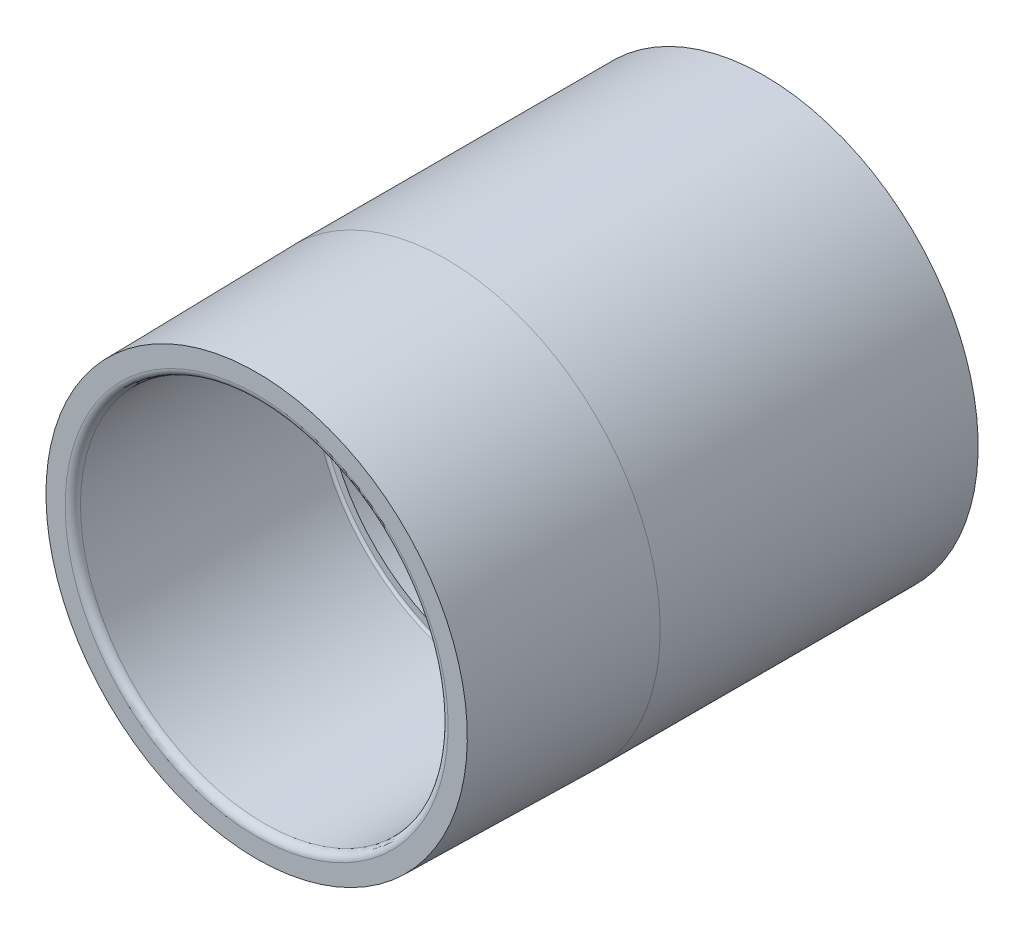
ISO-10303-21;
HEADER;
FILE_DESCRIPTION(('STEP AP214'),'2;1');
FILE_NAME('part.step','',(''),(''),'','','');
FILE_SCHEMA(('AUTOMOTIVE_DESIGN { 1 0 10303 214 1 1 1 1 }'));
ENDSEC;
DATA;
#1=APPLICATION_CONTEXT('core data for automotive mechanical design processes');
#2=APPLICATION_PROTOCOL_DEFINITION('international standard','automotive_design',2000,#1);
#3=PRODUCT_CONTEXT('',#1,'mechanical');
#4=PRODUCT('Part','Part','',(#3));
#5=PRODUCT_RELATED_PRODUCT_CATEGORY('part','',(#4));
#6=PRODUCT_DEFINITION_FORMATION('','',#4);
#7=PRODUCT_DEFINITION_CONTEXT('part definition',#1,'design');
#8=PRODUCT_DEFINITION('design','',#6,#7);
#9=PRODUCT_DEFINITION_SHAPE('','',#8);
#10=(LENGTH_UNIT() NAMED_UNIT(*) SI_UNIT(.MILLI.,.METRE.));
#11=(NAMED_UNIT(*) PLANE_ANGLE_UNIT() SI_UNIT($,.RADIAN.));
#12=(NAMED_UNIT(*) SI_UNIT($,.STERADIAN.) SOLID_ANGLE_UNIT());
#13=UNCERTAINTY_MEASURE_WITH_UNIT(LENGTH_MEASURE(1.E-05),#10,'distance_accuracy_value','');
#14=(GEOMETRIC_REPRESENTATION_CONTEXT(3) GLOBAL_UNCERTAINTY_ASSIGNED_CONTEXT((#13)) GLOBAL_UNIT_ASSIGNED_CONTEXT((#10,
#11,#12)) REPRESENTATION_CONTEXT('',''));
#15=CARTESIAN_POINT('',(0.,0.,0.));
#16=DIRECTION('',(0.,0.,1.));
#17=DIRECTION('',(1.,0.,0.));
#18=AXIS2_PLACEMENT_3D('',#15,#16,#17);
#19=CARTESIAN_POINT('',(0.,-42.7101,-50.6476));
#20=DIRECTION('',(0.,0.,-1.));
#21=DIRECTION('',(0.,1.,0.));
#22=AXIS2_PLACEMENT_3D('',#19,#20,#21);
#23=PLANE('',#22);
#24=CARTESIAN_POINT('',(0.,0.,-50.6476));
#25=DIRECTION('',(0.,0.,-1.));
#26=DIRECTION('',(0.,1.,0.));
#27=AXIS2_PLACEMENT_3D('',#24,#25,#26);
#28=CIRCLE('',#27,38.2143);
#29=CARTESIAN_POINT('',(0.,38.2143,-50.6476));
#30=VERTEX_POINT('',#29);
#31=EDGE_CURVE('E110',#30,#30,#28,.F.);
#32=ORIENTED_EDGE('',*,*,#31,.T.);
#33=EDGE_LOOP('',(#32));
#34=FACE_BOUND('',#33,.T.);
#35=CARTESIAN_POINT('',(0.,0.,-50.6476));
#36=DIRECTION('',(0.,0.,1.));
#37=DIRECTION('',(0.,-1.,0.));
#38=AXIS2_PLACEMENT_3D('',#35,#36,#37);
#39=CIRCLE('',#38,42.7101);
#40=CARTESIAN_POINT('',(0.,-42.7101,-50.6476));
#41=VERTEX_POINT('',#40);
#42=EDGE_CURVE('E128',#41,#41,#39,.T.);
#43=ORIENTED_EDGE('',*,*,#42,.F.);
#44=EDGE_LOOP('',(#43));
#45=FACE_BOUND('',#44,.T.);
#46=ADVANCED_FACE('F72',(#34,#45),#23,.T.);
#47=CARTESIAN_POINT('',(0.,0.,50.6476));
#48=DIRECTION('',(0.,0.,1.));
#49=DIRECTION('',(0.,-1.,0.));
#50=AXIS2_PLACEMENT_3D('',#47,#48,#49);
#51=CYLINDRICAL_SURFACE('',#50,36.6903);
#52=CARTESIAN_POINT('',(0.,0.,-2.89559999999999));
#53=DIRECTION('',(0.,0.,-1.));
#54=DIRECTION('',(0.,1.,0.));
#55=AXIS2_PLACEMENT_3D('',#52,#53,#54);
#56=CIRCLE('',#55,36.6903);
#57=CARTESIAN_POINT('',(0.,36.6903,-2.89559999999998));
#58=VERTEX_POINT('',#57);
#59=EDGE_CURVE('E92',#58,#58,#56,.F.);
#60=ORIENTED_EDGE('',*,*,#59,.T.);
#61=EDGE_LOOP('',(#60));
#62=FACE_BOUND('',#61,.T.);
#63=CARTESIAN_POINT('',(0.,0.,-49.1236));
#64=DIRECTION('',(0.,0.,-1.));
#65=DIRECTION('',(0.,1.,0.));
#66=AXIS2_PLACEMENT_3D('',#63,#64,#65);
#67=CIRCLE('',#66,36.6903);
#68=CARTESIAN_POINT('',(0.,36.6903,-49.1236));
#69=VERTEX_POINT('',#68);
#70=EDGE_CURVE('E106',#69,#69,#67,.T.);
#71=ORIENTED_EDGE('',*,*,#70,.T.);
#72=EDGE_LOOP('',(#71));
#73=FACE_BOUND('',#72,.T.);
#74=ADVANCED_FACE('F137',(#62,#73),#51,.F.);
#75=CARTESIAN_POINT('',(0.,-36.6903,-2.3876));
#76=DIRECTION('',(0.,0.,-1.));
#77=DIRECTION('',(0.,1.,0.));
#78=AXIS2_PLACEMENT_3D('',#75,#76,#77);
#79=PLANE('',#78);
#80=CARTESIAN_POINT('',(0.,0.,-2.3876));
#81=DIRECTION('',(0.,0.,-1.));
#82=DIRECTION('',(0.,1.,0.));
#83=AXIS2_PLACEMENT_3D('',#80,#81,#82);
#84=CIRCLE('',#83,36.1823);
#85=CARTESIAN_POINT('',(0.,36.1823,-2.38759999999999));
#86=VERTEX_POINT('',#85);
#87=EDGE_CURVE('E86',#86,#86,#84,.T.);
#88=ORIENTED_EDGE('',*,*,#87,.T.);
#89=EDGE_LOOP('',(#88));
#90=FACE_BOUND('',#89,.T.);
#91=CARTESIAN_POINT('',(0.,0.,-2.38759999999999));
#92=DIRECTION('',(0.,0.,1.));
#93=DIRECTION('',(0.,-1.,0.));
#94=AXIS2_PLACEMENT_3D('',#91,#92,#93);
#95=CIRCLE('',#94,34.798);
#96=CARTESIAN_POINT('',(0.,-34.798,-2.3876));
#97=VERTEX_POINT('',#96);
#98=EDGE_CURVE('E114',#97,#97,#95,.T.);
#99=ORIENTED_EDGE('',*,*,#98,.T.);
#100=EDGE_LOOP('',(#99));
#101=FACE_BOUND('',#100,.T.);
#102=ADVANCED_FACE('F143',(#90,#101),#79,.T.);
#103=CARTESIAN_POINT('',(0.,0.,50.6476));
#104=DIRECTION('',(0.,0.,1.));
#105=DIRECTION('',(0.,-1.,0.));
#106=AXIS2_PLACEMENT_3D('',#103,#104,#105);
#107=CYLINDRICAL_SURFACE('',#106,34.798);
#108=CARTESIAN_POINT('',(0.,0.,2.3876));
#109=DIRECTION('',(0.,0.,1.));
#110=DIRECTION('',(0.,-1.,0.));
#111=AXIS2_PLACEMENT_3D('',#108,#109,#110);
#112=CIRCLE('',#111,34.798);
#113=CARTESIAN_POINT('',(0.,-34.798,2.3876));
#114=VERTEX_POINT('',#113);
#115=EDGE_CURVE('E118',#114,#114,#112,.T.);
#116=ORIENTED_EDGE('',*,*,#115,.T.);
#117=EDGE_LOOP('',(#116));
#118=FACE_BOUND('',#117,.T.);
#119=ORIENTED_EDGE('',*,*,#98,.F.);
#120=EDGE_LOOP('',(#119));
#121=FACE_BOUND('',#120,.T.);
#122=ADVANCED_FACE('F172',(#118,#121),#107,.F.);
#123=CARTESIAN_POINT('',(0.,-36.6903,2.3876));
#124=DIRECTION('',(0.,0.,1.));
#125=DIRECTION('',(0.,-1.,0.));
#126=AXIS2_PLACEMENT_3D('',#123,#124,#125);
#127=PLANE('',#126);
#128=CARTESIAN_POINT('',(0.,0.,2.38760000000001));
#129=DIRECTION('',(0.,0.,1.));
#130=DIRECTION('',(0.,-1.,0.));
#131=AXIS2_PLACEMENT_3D('',#128,#129,#130);
#132=CIRCLE('',#131,36.1823);
#133=CARTESIAN_POINT('',(0.,-36.1823,2.3876));
#134=VERTEX_POINT('',#133);
#135=EDGE_CURVE('E80',#134,#134,#132,.T.);
#136=ORIENTED_EDGE('',*,*,#135,.T.);
#137=EDGE_LOOP('',(#136));
#138=FACE_BOUND('',#137,.T.);
#139=ORIENTED_EDGE('',*,*,#115,.F.);
#140=EDGE_LOOP('',(#139));
#141=FACE_BOUND('',#140,.T.);
#142=ADVANCED_FACE('F176',(#138,#141),#127,.T.);
#143=CARTESIAN_POINT('',(0.,0.,50.6476));
#144=DIRECTION('',(0.,0.,1.));
#145=DIRECTION('',(0.,-1.,0.));
#146=AXIS2_PLACEMENT_3D('',#143,#144,#145);
#147=CYLINDRICAL_SURFACE('',#146,36.6903);
#148=CARTESIAN_POINT('',(0.,0.,2.89560000000001));
#149=DIRECTION('',(0.,0.,1.));
#150=DIRECTION('',(0.,-1.,0.));
#151=AXIS2_PLACEMENT_3D('',#148,#149,#150);
#152=CIRCLE('',#151,36.6903);
#153=CARTESIAN_POINT('',(0.,-36.6903,2.8956));
#154=VERTEX_POINT('',#153);
#155=EDGE_CURVE('E11',#154,#154,#152,.F.);
#156=ORIENTED_EDGE('',*,*,#155,.T.);
#157=EDGE_LOOP('',(#156));
#158=FACE_BOUND('',#157,.T.);
#159=CARTESIAN_POINT('',(0.,0.,49.1236));
#160=DIRECTION('',(0.,0.,1.));
#161=DIRECTION('',(0.,-1.,0.));
#162=AXIS2_PLACEMENT_3D('',#159,#160,#161);
#163=CIRCLE('',#162,36.6903);
#164=CARTESIAN_POINT('',(0.,-36.6903,49.1236));
#165=VERTEX_POINT('',#164);
#166=EDGE_CURVE('E102',#165,#165,#163,.T.);
#167=ORIENTED_EDGE('',*,*,#166,.T.);
#168=EDGE_LOOP('',(#167));
#169=FACE_BOUND('',#168,.T.);
#170=ADVANCED_FACE('F182',(#158,#169),#147,.F.);
#171=CARTESIAN_POINT('',(0.,-42.0497,50.6476));
#172=DIRECTION('',(0.,0.,1.));
#173=DIRECTION('',(0.,-1.,0.));
#174=AXIS2_PLACEMENT_3D('',#171,#172,#173);
#175=PLANE('',#174);
#176=CARTESIAN_POINT('',(0.,0.,50.6476));
#177=DIRECTION('',(0.,0.,1.));
#178=DIRECTION('',(0.,-1.,0.));
#179=AXIS2_PLACEMENT_3D('',#176,#177,#178);
#180=CIRCLE('',#179,38.2143);
#181=CARTESIAN_POINT('',(0.,-38.2143,50.6476));
#182=VERTEX_POINT('',#181);
#183=EDGE_CURVE('E98',#182,#182,#180,.F.);
#184=ORIENTED_EDGE('',*,*,#183,.T.);
#185=EDGE_LOOP('',(#184));
#186=FACE_BOUND('',#185,.T.);
#187=CARTESIAN_POINT('',(0.,0.,50.6476));
#188=DIRECTION('',(0.,0.,1.));
#189=DIRECTION('',(0.,-1.,0.));
#190=AXIS2_PLACEMENT_3D('',#187,#188,#189);
#191=CIRCLE('',#190,42.0497);
#192=CARTESIAN_POINT('',(0.,-42.0497,50.6476));
#193=VERTEX_POINT('',#192);
#194=EDGE_CURVE('E121',#193,#193,#191,.T.);
#195=ORIENTED_EDGE('',*,*,#194,.T.);
#196=EDGE_LOOP('',(#195));
#197=FACE_BOUND('',#196,.T.);
#198=ADVANCED_FACE('F187',(#186,#197),#175,.T.);
#199=CARTESIAN_POINT('',(0.,0.,50.6476));
#200=DIRECTION('',(0.,0.,-1.));
#201=DIRECTION('',(0.,1.,0.));
#202=AXIS2_PLACEMENT_3D('',#199,#200,#201);
#203=CONICAL_SURFACE('',#202,42.0497,0.0174532925199366);
#204=CARTESIAN_POINT('',(0.,0.,12.8133093390321));
#205=DIRECTION('',(0.,0.,1.));
#206=DIRECTION('',(0.,-1.,0.));
#207=AXIS2_PLACEMENT_3D('',#204,#205,#206);
#208=CIRCLE('',#207,42.7101);
#209=CARTESIAN_POINT('',(0.,-42.7101,12.8133093390321));
#210=VERTEX_POINT('',#209);
#211=EDGE_CURVE('E125',#210,#210,#208,.T.);
#212=ORIENTED_EDGE('',*,*,#211,.T.);
#213=EDGE_LOOP('',(#212));
#214=FACE_BOUND('',#213,.T.);
#215=ORIENTED_EDGE('',*,*,#194,.F.);
#216=EDGE_LOOP('',(#215));
#217=FACE_BOUND('',#216,.T.);
#218=ADVANCED_FACE('F190',(#214,#217),#203,.T.);
#219=CARTESIAN_POINT('',(0.,0.,50.6476));
#220=DIRECTION('',(0.,0.,1.));
#221=DIRECTION('',(0.,-1.,0.));
#222=AXIS2_PLACEMENT_3D('',#219,#220,#221);
#223=CYLINDRICAL_SURFACE('',#222,42.7101);
#224=ORIENTED_EDGE('',*,*,#42,.T.);
#225=EDGE_LOOP('',(#224));
#226=FACE_BOUND('',#225,.T.);
#227=ORIENTED_EDGE('',*,*,#211,.F.);
#228=EDGE_LOOP('',(#227));
#229=FACE_BOUND('',#228,.T.);
#230=ADVANCED_FACE('F133',(#226,#229),#223,.T.);
#231=CARTESIAN_POINT('',(0.,0.,-49.1236));
#232=DIRECTION('',(0.,0.,-1.));
#233=DIRECTION('',(0.,1.,0.));
#234=AXIS2_PLACEMENT_3D('',#231,#232,#233);
#235=TOROIDAL_SURFACE('',#234,38.2143,1.524);
#236=ORIENTED_EDGE('',*,*,#70,.F.);
#237=EDGE_LOOP('',(#236));
#238=FACE_BOUND('',#237,.T.);
#239=ORIENTED_EDGE('',*,*,#31,.F.);
#240=EDGE_LOOP('',(#239));
#241=FACE_BOUND('',#240,.T.);
#242=ADVANCED_FACE('F148',(#238,#241),#235,.T.);
#243=CARTESIAN_POINT('',(0.,0.,49.1236));
#244=DIRECTION('',(0.,0.,1.));
#245=DIRECTION('',(0.,-1.,0.));
#246=AXIS2_PLACEMENT_3D('',#243,#244,#245);
#247=TOROIDAL_SURFACE('',#246,38.2143,1.524);
#248=ORIENTED_EDGE('',*,*,#183,.F.);
#249=EDGE_LOOP('',(#248));
#250=FACE_BOUND('',#249,.T.);
#251=ORIENTED_EDGE('',*,*,#166,.F.);
#252=EDGE_LOOP('',(#251));
#253=FACE_BOUND('',#252,.T.);
#254=ADVANCED_FACE('F151',(#250,#253),#247,.T.);
#255=CARTESIAN_POINT('',(0.,0.,-2.89559999999999));
#256=DIRECTION('',(0.,0.,-1.));
#257=DIRECTION('',(0.,1.,0.));
#258=AXIS2_PLACEMENT_3D('',#255,#256,#257);
#259=TOROIDAL_SURFACE('',#258,36.1823,0.508);
#260=ORIENTED_EDGE('',*,*,#87,.F.);
#261=EDGE_LOOP('',(#260));
#262=FACE_BOUND('',#261,.T.);
#263=ORIENTED_EDGE('',*,*,#59,.F.);
#264=EDGE_LOOP('',(#263));
#265=FACE_BOUND('',#264,.T.);
#266=ADVANCED_FACE('F154',(#262,#265),#259,.F.);
#267=CARTESIAN_POINT('',(0.,0.,2.89560000000001));
#268=DIRECTION('',(0.,0.,1.));
#269=DIRECTION('',(0.,-1.,0.));
#270=AXIS2_PLACEMENT_3D('',#267,#268,#269);
#271=TOROIDAL_SURFACE('',#270,36.1823,0.508);
#272=ORIENTED_EDGE('',*,*,#155,.F.);
#273=EDGE_LOOP('',(#272));
#274=FACE_BOUND('',#273,.T.);
#275=ORIENTED_EDGE('',*,*,#135,.F.);
#276=EDGE_LOOP('',(#275));
#277=FACE_BOUND('',#276,.T.);
#278=ADVANCED_FACE('F74',(#274,#277),#271,.F.);
#279=CLOSED_SHELL('',(#46,#74,#102,#122,#142,#170,#198,#218,#230,#242,#254,#266,#278));
#280=MANIFOLD_SOLID_BREP('B2',#279);
#281=ADVANCED_BREP_SHAPE_REPRESENTATION('',(#18,#280),#14);
#282=SHAPE_DEFINITION_REPRESENTATION(#9,#281);
ENDSEC;
END-ISO-10303-21;
